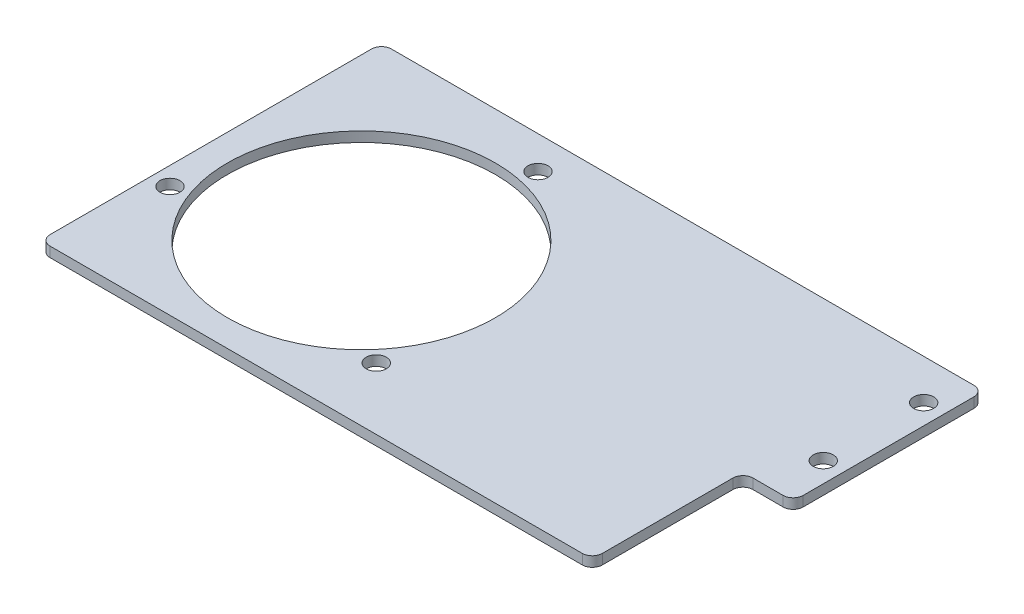
ISO-10303-21;
HEADER;
FILE_DESCRIPTION(('STEP AP214'),'2;1');
FILE_NAME('part.step','',(''),(''),'','','');
FILE_SCHEMA(('AUTOMOTIVE_DESIGN { 1 0 10303 214 1 1 1 1 }'));
ENDSEC;
DATA;
#1=APPLICATION_CONTEXT('core data for automotive mechanical design processes');
#2=APPLICATION_PROTOCOL_DEFINITION('international standard','automotive_design',2000,#1);
#3=PRODUCT_CONTEXT('',#1,'mechanical');
#4=PRODUCT('Part','Part','',(#3));
#5=PRODUCT_RELATED_PRODUCT_CATEGORY('part','',(#4));
#6=PRODUCT_DEFINITION_FORMATION('','',#4);
#7=PRODUCT_DEFINITION_CONTEXT('part definition',#1,'design');
#8=PRODUCT_DEFINITION('design','',#6,#7);
#9=PRODUCT_DEFINITION_SHAPE('','',#8);
#10=(LENGTH_UNIT() NAMED_UNIT(*) SI_UNIT(.MILLI.,.METRE.));
#11=(NAMED_UNIT(*) PLANE_ANGLE_UNIT() SI_UNIT($,.RADIAN.));
#12=(NAMED_UNIT(*) SI_UNIT($,.STERADIAN.) SOLID_ANGLE_UNIT());
#13=UNCERTAINTY_MEASURE_WITH_UNIT(LENGTH_MEASURE(1.E-05),#10,'distance_accuracy_value','');
#14=(GEOMETRIC_REPRESENTATION_CONTEXT(3) GLOBAL_UNCERTAINTY_ASSIGNED_CONTEXT((#13)) GLOBAL_UNIT_ASSIGNED_CONTEXT((#10,
#11,#12)) REPRESENTATION_CONTEXT('',''));
#15=CARTESIAN_POINT('',(0.,0.,0.));
#16=DIRECTION('',(0.,0.,1.));
#17=DIRECTION('',(1.,0.,0.));
#18=AXIS2_PLACEMENT_3D('',#15,#16,#17);
#19=CARTESIAN_POINT('',(254.,6.35,12.7));
#20=DIRECTION('',(0.,-1.,0.));
#21=DIRECTION('',(0.,0.,-1.));
#22=AXIS2_PLACEMENT_3D('',#19,#20,#21);
#23=PLANE('',#22);
#24=CARTESIAN_POINT('',(18.1745568096169,6.35,-93.4999892233898));
#25=DIRECTION('',(0.,1.,0.));
#26=DIRECTION('',(0.,0.,1.));
#27=AXIS2_PLACEMENT_3D('',#24,#25,#26);
#28=CIRCLE('',#27,6.34999999999998);
#29=CARTESIAN_POINT('',(18.1745568096169,6.35,-87.1499892233898));
#30=VERTEX_POINT('',#29);
#31=EDGE_CURVE('E299',#30,#30,#28,.T.);
#32=ORIENTED_EDGE('',*,*,#31,.F.);
#33=EDGE_LOOP('',(#32));
#34=FACE_BOUND('',#33,.T.);
#35=CARTESIAN_POINT('',(266.7,6.35,-88.9000000000001));
#36=DIRECTION('',(0.,1.,0.));
#37=DIRECTION('',(0.,0.,1.));
#38=AXIS2_PLACEMENT_3D('',#35,#36,#37);
#39=CIRCLE('',#38,6.35);
#40=CARTESIAN_POINT('',(266.7,6.35,-82.5500000000001));
#41=VERTEX_POINT('',#40);
#42=EDGE_CURVE('E311',#41,#41,#39,.T.);
#43=ORIENTED_EDGE('',*,*,#42,.F.);
#44=EDGE_LOOP('',(#43));
#45=FACE_BOUND('',#44,.T.);
#46=CARTESIAN_POINT('',(0.,6.35,0.));
#47=DIRECTION('',(0.,1.,0.));
#48=DIRECTION('',(0.,0.,1.));
#49=AXIS2_PLACEMENT_3D('',#46,#47,#48);
#50=CIRCLE('',#49,84.7725);
#51=CARTESIAN_POINT('',(0.,6.35,84.7725));
#52=VERTEX_POINT('',#51);
#53=EDGE_CURVE('E157',#52,#52,#50,.T.);
#54=ORIENTED_EDGE('',*,*,#53,.F.);
#55=EDGE_LOOP('',(#54));
#56=FACE_BOUND('',#55,.T.);
#57=CARTESIAN_POINT('',(254.,6.35,12.7));
#58=DIRECTION('',(0.,-1.,0.));
#59=DIRECTION('',(0.,0.,-1.));
#60=AXIS2_PLACEMENT_3D('',#57,#58,#59);
#61=CIRCLE('',#60,6.35);
#62=CARTESIAN_POINT('',(247.65,6.35,12.7));
#63=VERTEX_POINT('',#62);
#64=CARTESIAN_POINT('',(254.,6.35,6.34999999999998));
#65=VERTEX_POINT('',#64);
#66=EDGE_CURVE('E176',#63,#65,#61,.T.);
#67=ORIENTED_EDGE('',*,*,#66,.T.);
#68=DIRECTION('',(1.,0.,0.));
#69=VECTOR('',#68,1.);
#70=CARTESIAN_POINT('',(254.,6.35,6.34999999999998));
#71=LINE('',#70,#69);
#72=CARTESIAN_POINT('',(273.05,6.35,6.34999999999999));
#73=VERTEX_POINT('',#72);
#74=EDGE_CURVE('E104',#65,#73,#71,.T.);
#75=ORIENTED_EDGE('',*,*,#74,.T.);
#76=CARTESIAN_POINT('',(273.05,6.35,0.));
#77=DIRECTION('',(0.,1.,0.));
#78=DIRECTION('',(0.,0.,1.));
#79=AXIS2_PLACEMENT_3D('',#76,#77,#78);
#80=CIRCLE('',#79,6.35000000000001);
#81=CARTESIAN_POINT('',(279.4,6.35,0.));
#82=VERTEX_POINT('',#81);
#83=EDGE_CURVE('E203',#73,#82,#80,.T.);
#84=ORIENTED_EDGE('',*,*,#83,.T.);
#85=DIRECTION('',(0.,0.,-1.));
#86=VECTOR('',#85,1.);
#87=CARTESIAN_POINT('',(279.4,6.35,-107.95));
#88=LINE('',#87,#86);
#89=CARTESIAN_POINT('',(279.4,6.35,-107.95));
#90=VERTEX_POINT('',#89);
#91=EDGE_CURVE('E222',#82,#90,#88,.T.);
#92=ORIENTED_EDGE('',*,*,#91,.T.);
#93=CARTESIAN_POINT('',(273.05,6.35,-107.95));
#94=DIRECTION('',(0.,1.,0.));
#95=DIRECTION('',(0.,0.,-1.));
#96=AXIS2_PLACEMENT_3D('',#93,#94,#95);
#97=CIRCLE('',#96,6.35000000000002);
#98=CARTESIAN_POINT('',(273.05,6.35,-114.3));
#99=VERTEX_POINT('',#98);
#100=EDGE_CURVE('E219',#90,#99,#97,.T.);
#101=ORIENTED_EDGE('',*,*,#100,.T.);
#102=DIRECTION('',(-1.,0.,0.));
#103=VECTOR('',#102,1.);
#104=CARTESIAN_POINT('',(273.05,6.35,-114.3));
#105=LINE('',#104,#103);
#106=CARTESIAN_POINT('',(-95.25,6.35,-114.3));
#107=VERTEX_POINT('',#106);
#108=EDGE_CURVE('E221',#99,#107,#105,.T.);
#109=ORIENTED_EDGE('',*,*,#108,.T.);
#110=CARTESIAN_POINT('',(-95.25,6.35,-107.95));
#111=DIRECTION('',(0.,1.,0.));
#112=DIRECTION('',(0.,0.,1.));
#113=AXIS2_PLACEMENT_3D('',#110,#111,#112);
#114=CIRCLE('',#113,6.35);
#115=CARTESIAN_POINT('',(-101.6,6.35,-107.95));
#116=VERTEX_POINT('',#115);
#117=EDGE_CURVE('E224',#107,#116,#114,.T.);
#118=ORIENTED_EDGE('',*,*,#117,.T.);
#119=DIRECTION('',(0.,0.,1.));
#120=VECTOR('',#119,1.);
#121=CARTESIAN_POINT('',(-101.6,6.35,-107.95));
#122=LINE('',#121,#120);
#123=CARTESIAN_POINT('',(-101.6,6.35,95.25));
#124=VERTEX_POINT('',#123);
#125=EDGE_CURVE('E230',#116,#124,#122,.T.);
#126=ORIENTED_EDGE('',*,*,#125,.T.);
#127=CARTESIAN_POINT('',(-95.2499999999999,6.35,95.2500000000001));
#128=DIRECTION('',(0.,1.,0.));
#129=DIRECTION('',(0.,0.,-1.));
#130=AXIS2_PLACEMENT_3D('',#127,#128,#129);
#131=CIRCLE('',#130,6.34999999999999);
#132=CARTESIAN_POINT('',(-95.2499999999999,6.35,101.6));
#133=VERTEX_POINT('',#132);
#134=EDGE_CURVE('E135',#124,#133,#131,.T.);
#135=ORIENTED_EDGE('',*,*,#134,.T.);
#136=DIRECTION('',(1.,0.,0.));
#137=VECTOR('',#136,1.);
#138=CARTESIAN_POINT('',(241.3,6.35,101.6));
#139=LINE('',#138,#137);
#140=CARTESIAN_POINT('',(241.3,6.35,101.6));
#141=VERTEX_POINT('',#140);
#142=EDGE_CURVE('E129',#133,#141,#139,.T.);
#143=ORIENTED_EDGE('',*,*,#142,.T.);
#144=CARTESIAN_POINT('',(241.3,6.35,95.25));
#145=DIRECTION('',(0.,1.,0.));
#146=DIRECTION('',(0.,0.,1.));
#147=AXIS2_PLACEMENT_3D('',#144,#145,#146);
#148=CIRCLE('',#147,6.34999999999999);
#149=CARTESIAN_POINT('',(247.65,6.35,95.25));
#150=VERTEX_POINT('',#149);
#151=EDGE_CURVE('E133',#141,#150,#148,.T.);
#152=ORIENTED_EDGE('',*,*,#151,.T.);
#153=DIRECTION('',(0.,0.,-1.));
#154=VECTOR('',#153,1.);
#155=CARTESIAN_POINT('',(247.65,6.35,95.25));
#156=LINE('',#155,#154);
#157=EDGE_CURVE('E49',#150,#63,#156,.T.);
#158=ORIENTED_EDGE('',*,*,#157,.T.);
#159=EDGE_LOOP('',(#67,#75,#84,#92,#101,#109,#118,#126,#135,#143,#152,#158));
#160=FACE_BOUND('',#159,.T.);
#161=CARTESIAN_POINT('',(-90.0606443258351,6.35,31.0103667120436));
#162=DIRECTION('',(0.,1.,0.));
#163=DIRECTION('',(0.,0.,1.));
#164=AXIS2_PLACEMENT_3D('',#161,#162,#163);
#165=CIRCLE('',#164,6.35);
#166=CARTESIAN_POINT('',(-90.0606443258351,6.35,37.3603667120436));
#167=VERTEX_POINT('',#166);
#168=EDGE_CURVE('E317',#167,#167,#165,.T.);
#169=ORIENTED_EDGE('',*,*,#168,.F.);
#170=EDGE_LOOP('',(#169));
#171=FACE_BOUND('',#170,.T.);
#172=CARTESIAN_POINT('',(266.7,6.35,-25.4000000000001));
#173=DIRECTION('',(0.,1.,0.));
#174=DIRECTION('',(0.,0.,1.));
#175=AXIS2_PLACEMENT_3D('',#172,#173,#174);
#176=CIRCLE('',#175,6.35);
#177=CARTESIAN_POINT('',(266.7,6.35,-19.0500000000001));
#178=VERTEX_POINT('',#177);
#179=EDGE_CURVE('E305',#178,#178,#176,.T.);
#180=ORIENTED_EDGE('',*,*,#179,.F.);
#181=EDGE_LOOP('',(#180));
#182=FACE_BOUND('',#181,.T.);
#183=CARTESIAN_POINT('',(71.8860875162181,6.35,62.4896225113469));
#184=DIRECTION('',(0.,1.,0.));
#185=DIRECTION('',(0.,0.,1.));
#186=AXIS2_PLACEMENT_3D('',#183,#184,#185);
#187=CIRCLE('',#186,6.35);
#188=CARTESIAN_POINT('',(71.8860875162181,6.35,68.8396225113469));
#189=VERTEX_POINT('',#188);
#190=EDGE_CURVE('E290',#189,#189,#187,.T.);
#191=ORIENTED_EDGE('',*,*,#190,.F.);
#192=EDGE_LOOP('',(#191));
#193=FACE_BOUND('',#192,.T.);
#194=ADVANCED_FACE('F32',(#34,#45,#56,#160,#171,#182,#193),#23,.F.);
#195=CARTESIAN_POINT('',(254.,0.,12.7));
#196=DIRECTION('',(0.,-1.,0.));
#197=DIRECTION('',(0.,0.,-1.));
#198=AXIS2_PLACEMENT_3D('',#195,#196,#197);
#199=PLANE('',#198);
#200=CARTESIAN_POINT('',(18.1745568096169,0.,-93.4999892233898));
#201=DIRECTION('',(0.,1.,0.));
#202=DIRECTION('',(0.,0.,1.));
#203=AXIS2_PLACEMENT_3D('',#200,#201,#202);
#204=CIRCLE('',#203,6.34999999999998);
#205=CARTESIAN_POINT('',(18.1745568096169,0.,-87.1499892233898));
#206=VERTEX_POINT('',#205);
#207=EDGE_CURVE('E296',#206,#206,#204,.T.);
#208=ORIENTED_EDGE('',*,*,#207,.T.);
#209=EDGE_LOOP('',(#208));
#210=FACE_BOUND('',#209,.T.);
#211=CARTESIAN_POINT('',(266.7,0.,-88.9000000000001));
#212=DIRECTION('',(0.,1.,0.));
#213=DIRECTION('',(0.,0.,1.));
#214=AXIS2_PLACEMENT_3D('',#211,#212,#213);
#215=CIRCLE('',#214,6.35);
#216=CARTESIAN_POINT('',(266.7,0.,-82.5500000000001));
#217=VERTEX_POINT('',#216);
#218=EDGE_CURVE('E308',#217,#217,#215,.T.);
#219=ORIENTED_EDGE('',*,*,#218,.T.);
#220=EDGE_LOOP('',(#219));
#221=FACE_BOUND('',#220,.T.);
#222=CARTESIAN_POINT('',(0.,0.,0.));
#223=DIRECTION('',(0.,1.,0.));
#224=DIRECTION('',(0.,0.,1.));
#225=AXIS2_PLACEMENT_3D('',#222,#223,#224);
#226=CIRCLE('',#225,84.7725);
#227=CARTESIAN_POINT('',(0.,0.,84.7725));
#228=VERTEX_POINT('',#227);
#229=EDGE_CURVE('E320',#228,#228,#226,.T.);
#230=ORIENTED_EDGE('',*,*,#229,.T.);
#231=EDGE_LOOP('',(#230));
#232=FACE_BOUND('',#231,.T.);
#233=CARTESIAN_POINT('',(254.,0.,12.7));
#234=DIRECTION('',(0.,-1.,0.));
#235=DIRECTION('',(0.,0.,-1.));
#236=AXIS2_PLACEMENT_3D('',#233,#234,#235);
#237=CIRCLE('',#236,6.35);
#238=CARTESIAN_POINT('',(247.65,0.,12.7));
#239=VERTEX_POINT('',#238);
#240=CARTESIAN_POINT('',(254.,0.,6.34999999999998));
#241=VERTEX_POINT('',#240);
#242=EDGE_CURVE('E153',#239,#241,#237,.T.);
#243=ORIENTED_EDGE('',*,*,#242,.F.);
#244=DIRECTION('',(0.,0.,-1.));
#245=VECTOR('',#244,1.);
#246=CARTESIAN_POINT('',(247.65,0.,95.25));
#247=LINE('',#246,#245);
#248=CARTESIAN_POINT('',(247.65,0.,95.25));
#249=VERTEX_POINT('',#248);
#250=EDGE_CURVE('E96',#249,#239,#247,.T.);
#251=ORIENTED_EDGE('',*,*,#250,.F.);
#252=CARTESIAN_POINT('',(241.3,0.,95.25));
#253=DIRECTION('',(0.,1.,0.));
#254=DIRECTION('',(0.,0.,1.));
#255=AXIS2_PLACEMENT_3D('',#252,#253,#254);
#256=CIRCLE('',#255,6.34999999999999);
#257=CARTESIAN_POINT('',(241.3,0.,101.6));
#258=VERTEX_POINT('',#257);
#259=EDGE_CURVE('E90',#258,#249,#256,.T.);
#260=ORIENTED_EDGE('',*,*,#259,.F.);
#261=DIRECTION('',(1.,0.,0.));
#262=VECTOR('',#261,1.);
#263=CARTESIAN_POINT('',(241.3,0.,101.6));
#264=LINE('',#263,#262);
#265=CARTESIAN_POINT('',(-95.2499999999999,0.,101.6));
#266=VERTEX_POINT('',#265);
#267=EDGE_CURVE('E143',#266,#258,#264,.T.);
#268=ORIENTED_EDGE('',*,*,#267,.F.);
#269=CARTESIAN_POINT('',(-95.2499999999999,0.,95.2500000000001));
#270=DIRECTION('',(0.,1.,0.));
#271=DIRECTION('',(0.,0.,-1.));
#272=AXIS2_PLACEMENT_3D('',#269,#270,#271);
#273=CIRCLE('',#272,6.34999999999999);
#274=CARTESIAN_POINT('',(-101.6,0.,95.25));
#275=VERTEX_POINT('',#274);
#276=EDGE_CURVE('E171',#275,#266,#273,.T.);
#277=ORIENTED_EDGE('',*,*,#276,.F.);
#278=DIRECTION('',(0.,0.,1.));
#279=VECTOR('',#278,1.);
#280=CARTESIAN_POINT('',(-101.6,0.,-107.95));
#281=LINE('',#280,#279);
#282=CARTESIAN_POINT('',(-101.6,0.,-107.95));
#283=VERTEX_POINT('',#282);
#284=EDGE_CURVE('E169',#283,#275,#281,.T.);
#285=ORIENTED_EDGE('',*,*,#284,.F.);
#286=CARTESIAN_POINT('',(-95.25,0.,-107.95));
#287=DIRECTION('',(0.,1.,0.));
#288=DIRECTION('',(0.,0.,1.));
#289=AXIS2_PLACEMENT_3D('',#286,#287,#288);
#290=CIRCLE('',#289,6.35);
#291=CARTESIAN_POINT('',(-95.25,0.,-114.3));
#292=VERTEX_POINT('',#291);
#293=EDGE_CURVE('E167',#292,#283,#290,.T.);
#294=ORIENTED_EDGE('',*,*,#293,.F.);
#295=DIRECTION('',(-1.,0.,0.));
#296=VECTOR('',#295,1.);
#297=CARTESIAN_POINT('',(273.05,0.,-114.3));
#298=LINE('',#297,#296);
#299=CARTESIAN_POINT('',(273.05,0.,-114.3));
#300=VERTEX_POINT('',#299);
#301=EDGE_CURVE('E165',#300,#292,#298,.T.);
#302=ORIENTED_EDGE('',*,*,#301,.F.);
#303=CARTESIAN_POINT('',(273.05,0.,-107.95));
#304=DIRECTION('',(0.,1.,0.));
#305=DIRECTION('',(0.,0.,-1.));
#306=AXIS2_PLACEMENT_3D('',#303,#304,#305);
#307=CIRCLE('',#306,6.35000000000002);
#308=CARTESIAN_POINT('',(279.4,0.,-107.95));
#309=VERTEX_POINT('',#308);
#310=EDGE_CURVE('E163',#309,#300,#307,.T.);
#311=ORIENTED_EDGE('',*,*,#310,.F.);
#312=DIRECTION('',(0.,0.,-1.));
#313=VECTOR('',#312,1.);
#314=CARTESIAN_POINT('',(279.4,0.,-107.95));
#315=LINE('',#314,#313);
#316=CARTESIAN_POINT('',(279.4,0.,0.));
#317=VERTEX_POINT('',#316);
#318=EDGE_CURVE('E161',#317,#309,#315,.T.);
#319=ORIENTED_EDGE('',*,*,#318,.F.);
#320=CARTESIAN_POINT('',(273.05,0.,0.));
#321=DIRECTION('',(0.,1.,0.));
#322=DIRECTION('',(0.,0.,1.));
#323=AXIS2_PLACEMENT_3D('',#320,#321,#322);
#324=CIRCLE('',#323,6.35000000000001);
#325=CARTESIAN_POINT('',(273.05,0.,6.34999999999999));
#326=VERTEX_POINT('',#325);
#327=EDGE_CURVE('E159',#326,#317,#324,.T.);
#328=ORIENTED_EDGE('',*,*,#327,.F.);
#329=DIRECTION('',(1.,0.,0.));
#330=VECTOR('',#329,1.);
#331=CARTESIAN_POINT('',(254.,0.,6.34999999999998));
#332=LINE('',#331,#330);
#333=EDGE_CURVE('E156',#241,#326,#332,.T.);
#334=ORIENTED_EDGE('',*,*,#333,.F.);
#335=EDGE_LOOP('',(#243,#251,#260,#268,#277,#285,#294,#302,#311,#319,#328,#334));
#336=FACE_BOUND('',#335,.T.);
#337=CARTESIAN_POINT('',(-90.0606443258351,0.,31.0103667120436));
#338=DIRECTION('',(0.,1.,0.));
#339=DIRECTION('',(0.,0.,1.));
#340=AXIS2_PLACEMENT_3D('',#337,#338,#339);
#341=CIRCLE('',#340,6.35);
#342=CARTESIAN_POINT('',(-90.0606443258351,0.,37.3603667120436));
#343=VERTEX_POINT('',#342);
#344=EDGE_CURVE('E314',#343,#343,#341,.T.);
#345=ORIENTED_EDGE('',*,*,#344,.T.);
#346=EDGE_LOOP('',(#345));
#347=FACE_BOUND('',#346,.T.);
#348=CARTESIAN_POINT('',(266.7,0.,-25.4000000000001));
#349=DIRECTION('',(0.,1.,0.));
#350=DIRECTION('',(0.,0.,1.));
#351=AXIS2_PLACEMENT_3D('',#348,#349,#350);
#352=CIRCLE('',#351,6.35);
#353=CARTESIAN_POINT('',(266.7,0.,-19.0500000000001));
#354=VERTEX_POINT('',#353);
#355=EDGE_CURVE('E302',#354,#354,#352,.T.);
#356=ORIENTED_EDGE('',*,*,#355,.T.);
#357=EDGE_LOOP('',(#356));
#358=FACE_BOUND('',#357,.T.);
#359=CARTESIAN_POINT('',(71.8860875162181,0.,62.4896225113469));
#360=DIRECTION('',(0.,1.,0.));
#361=DIRECTION('',(0.,0.,1.));
#362=AXIS2_PLACEMENT_3D('',#359,#360,#361);
#363=CIRCLE('',#362,6.35);
#364=CARTESIAN_POINT('',(71.8860875162181,0.,68.8396225113469));
#365=VERTEX_POINT('',#364);
#366=EDGE_CURVE('E293',#365,#365,#363,.T.);
#367=ORIENTED_EDGE('',*,*,#366,.T.);
#368=EDGE_LOOP('',(#367));
#369=FACE_BOUND('',#368,.T.);
#370=ADVANCED_FACE('F207',(#210,#221,#232,#336,#347,#358,#369),#199,.T.);
#371=CARTESIAN_POINT('',(254.,6.35,12.7));
#372=DIRECTION('',(0.,-1.,0.));
#373=DIRECTION('',(0.,0.,-1.));
#374=AXIS2_PLACEMENT_3D('',#371,#372,#373);
#375=CYLINDRICAL_SURFACE('',#374,6.35);
#376=ORIENTED_EDGE('',*,*,#242,.T.);
#377=DIRECTION('',(0.,-1.,0.));
#378=VECTOR('',#377,1.);
#379=CARTESIAN_POINT('',(254.,6.35,6.34999999999998));
#380=LINE('',#379,#378);
#381=EDGE_CURVE('E11',#65,#241,#380,.T.);
#382=ORIENTED_EDGE('',*,*,#381,.F.);
#383=ORIENTED_EDGE('',*,*,#66,.F.);
#384=DIRECTION('',(0.,-1.,0.));
#385=VECTOR('',#384,1.);
#386=CARTESIAN_POINT('',(247.65,6.35,12.7));
#387=LINE('',#386,#385);
#388=EDGE_CURVE('E149',#63,#239,#387,.T.);
#389=ORIENTED_EDGE('',*,*,#388,.T.);
#390=EDGE_LOOP('',(#376,#382,#383,#389));
#391=FACE_BOUND('',#390,.T.);
#392=ADVANCED_FACE('F34',(#391),#375,.F.);
#393=CARTESIAN_POINT('',(254.,6.35,6.34999999999998));
#394=DIRECTION('',(0.,0.,-1.));
#395=DIRECTION('',(-1.,0.,0.));
#396=AXIS2_PLACEMENT_3D('',#393,#394,#395);
#397=PLANE('',#396);
#398=ORIENTED_EDGE('',*,*,#333,.T.);
#399=DIRECTION('',(0.,-1.,0.));
#400=VECTOR('',#399,1.);
#401=CARTESIAN_POINT('',(273.05,6.35,6.34999999999999));
#402=LINE('',#401,#400);
#403=EDGE_CURVE('E41',#73,#326,#402,.T.);
#404=ORIENTED_EDGE('',*,*,#403,.F.);
#405=ORIENTED_EDGE('',*,*,#74,.F.);
#406=ORIENTED_EDGE('',*,*,#381,.T.);
#407=EDGE_LOOP('',(#398,#404,#405,#406));
#408=FACE_BOUND('',#407,.T.);
#409=ADVANCED_FACE('F447',(#408),#397,.F.);
#410=CARTESIAN_POINT('',(273.05,6.35,0.));
#411=DIRECTION('',(0.,-1.,0.));
#412=DIRECTION('',(0.,0.,-1.));
#413=AXIS2_PLACEMENT_3D('',#410,#411,#412);
#414=CYLINDRICAL_SURFACE('',#413,6.35000000000001);
#415=ORIENTED_EDGE('',*,*,#327,.T.);
#416=DIRECTION('',(0.,-1.,0.));
#417=VECTOR('',#416,1.);
#418=CARTESIAN_POINT('',(279.4,6.35,0.));
#419=LINE('',#418,#417);
#420=EDGE_CURVE('E195',#82,#317,#419,.T.);
#421=ORIENTED_EDGE('',*,*,#420,.F.);
#422=ORIENTED_EDGE('',*,*,#83,.F.);
#423=ORIENTED_EDGE('',*,*,#403,.T.);
#424=EDGE_LOOP('',(#415,#421,#422,#423));
#425=FACE_BOUND('',#424,.T.);
#426=ADVANCED_FACE('F201',(#425),#414,.T.);
#427=CARTESIAN_POINT('',(279.4,6.35,-107.95));
#428=DIRECTION('',(-1.,0.,0.));
#429=DIRECTION('',(0.,0.,1.));
#430=AXIS2_PLACEMENT_3D('',#427,#428,#429);
#431=PLANE('',#430);
#432=ORIENTED_EDGE('',*,*,#318,.T.);
#433=DIRECTION('',(0.,-1.,0.));
#434=VECTOR('',#433,1.);
#435=CARTESIAN_POINT('',(279.4,6.35,-107.95));
#436=LINE('',#435,#434);
#437=EDGE_CURVE('E192',#90,#309,#436,.T.);
#438=ORIENTED_EDGE('',*,*,#437,.F.);
#439=ORIENTED_EDGE('',*,*,#91,.F.);
#440=ORIENTED_EDGE('',*,*,#420,.T.);
#441=EDGE_LOOP('',(#432,#438,#439,#440));
#442=FACE_BOUND('',#441,.T.);
#443=ADVANCED_FACE('F213',(#442),#431,.F.);
#444=CARTESIAN_POINT('',(273.05,6.35,-107.95));
#445=DIRECTION('',(0.,-1.,0.));
#446=DIRECTION('',(0.,0.,-1.));
#447=AXIS2_PLACEMENT_3D('',#444,#445,#446);
#448=CYLINDRICAL_SURFACE('',#447,6.35000000000002);
#449=ORIENTED_EDGE('',*,*,#310,.T.);
#450=DIRECTION('',(0.,-1.,0.));
#451=VECTOR('',#450,1.);
#452=CARTESIAN_POINT('',(273.05,6.35,-114.3));
#453=LINE('',#452,#451);
#454=EDGE_CURVE('E189',#99,#300,#453,.T.);
#455=ORIENTED_EDGE('',*,*,#454,.F.);
#456=ORIENTED_EDGE('',*,*,#100,.F.);
#457=ORIENTED_EDGE('',*,*,#437,.T.);
#458=EDGE_LOOP('',(#449,#455,#456,#457));
#459=FACE_BOUND('',#458,.T.);
#460=ADVANCED_FACE('F217',(#459),#448,.T.);
#461=CARTESIAN_POINT('',(273.05,6.35,-114.3));
#462=DIRECTION('',(0.,0.,1.));
#463=DIRECTION('',(1.,0.,0.));
#464=AXIS2_PLACEMENT_3D('',#461,#462,#463);
#465=PLANE('',#464);
#466=ORIENTED_EDGE('',*,*,#301,.T.);
#467=DIRECTION('',(0.,-1.,0.));
#468=VECTOR('',#467,1.);
#469=CARTESIAN_POINT('',(-95.25,6.35,-114.3));
#470=LINE('',#469,#468);
#471=EDGE_CURVE('E186',#107,#292,#470,.T.);
#472=ORIENTED_EDGE('',*,*,#471,.F.);
#473=ORIENTED_EDGE('',*,*,#108,.F.);
#474=ORIENTED_EDGE('',*,*,#454,.T.);
#475=EDGE_LOOP('',(#466,#472,#473,#474));
#476=FACE_BOUND('',#475,.T.);
#477=ADVANCED_FACE('F412',(#476),#465,.F.);
#478=CARTESIAN_POINT('',(-95.25,6.35,-107.95));
#479=DIRECTION('',(0.,-1.,0.));
#480=DIRECTION('',(0.,0.,-1.));
#481=AXIS2_PLACEMENT_3D('',#478,#479,#480);
#482=CYLINDRICAL_SURFACE('',#481,6.35);
#483=ORIENTED_EDGE('',*,*,#293,.T.);
#484=DIRECTION('',(0.,-1.,0.));
#485=VECTOR('',#484,1.);
#486=CARTESIAN_POINT('',(-101.6,6.35,-107.95));
#487=LINE('',#486,#485);
#488=EDGE_CURVE('E183',#116,#283,#487,.T.);
#489=ORIENTED_EDGE('',*,*,#488,.F.);
#490=ORIENTED_EDGE('',*,*,#117,.F.);
#491=ORIENTED_EDGE('',*,*,#471,.T.);
#492=EDGE_LOOP('',(#483,#489,#490,#491));
#493=FACE_BOUND('',#492,.T.);
#494=ADVANCED_FACE('F403',(#493),#482,.T.);
#495=CARTESIAN_POINT('',(-101.6,6.35,-107.95));
#496=DIRECTION('',(1.,0.,0.));
#497=DIRECTION('',(0.,0.,-1.));
#498=AXIS2_PLACEMENT_3D('',#495,#496,#497);
#499=PLANE('',#498);
#500=ORIENTED_EDGE('',*,*,#284,.T.);
#501=DIRECTION('',(0.,-1.,0.));
#502=VECTOR('',#501,1.);
#503=CARTESIAN_POINT('',(-101.6,6.35,95.25));
#504=LINE('',#503,#502);
#505=EDGE_CURVE('E180',#124,#275,#504,.T.);
#506=ORIENTED_EDGE('',*,*,#505,.F.);
#507=ORIENTED_EDGE('',*,*,#125,.F.);
#508=ORIENTED_EDGE('',*,*,#488,.T.);
#509=EDGE_LOOP('',(#500,#506,#507,#508));
#510=FACE_BOUND('',#509,.T.);
#511=ADVANCED_FACE('F236',(#510),#499,.F.);
#512=CARTESIAN_POINT('',(-95.2499999999999,6.35,95.2500000000001));
#513=DIRECTION('',(0.,-1.,0.));
#514=DIRECTION('',(0.,0.,-1.));
#515=AXIS2_PLACEMENT_3D('',#512,#513,#514);
#516=CYLINDRICAL_SURFACE('',#515,6.34999999999999);
#517=ORIENTED_EDGE('',*,*,#276,.T.);
#518=DIRECTION('',(0.,-1.,0.));
#519=VECTOR('',#518,1.);
#520=CARTESIAN_POINT('',(-95.2499999999999,6.35,101.6));
#521=LINE('',#520,#519);
#522=EDGE_CURVE('E144',#133,#266,#521,.T.);
#523=ORIENTED_EDGE('',*,*,#522,.F.);
#524=ORIENTED_EDGE('',*,*,#134,.F.);
#525=ORIENTED_EDGE('',*,*,#505,.T.);
#526=EDGE_LOOP('',(#517,#523,#524,#525));
#527=FACE_BOUND('',#526,.T.);
#528=ADVANCED_FACE('F240',(#527),#516,.T.);
#529=CARTESIAN_POINT('',(241.3,6.35,101.6));
#530=DIRECTION('',(0.,0.,-1.));
#531=DIRECTION('',(-1.,0.,0.));
#532=AXIS2_PLACEMENT_3D('',#529,#530,#531);
#533=PLANE('',#532);
#534=ORIENTED_EDGE('',*,*,#267,.T.);
#535=DIRECTION('',(0.,-1.,0.));
#536=VECTOR('',#535,1.);
#537=CARTESIAN_POINT('',(241.3,6.35,101.6));
#538=LINE('',#537,#536);
#539=EDGE_CURVE('E140',#141,#258,#538,.T.);
#540=ORIENTED_EDGE('',*,*,#539,.F.);
#541=ORIENTED_EDGE('',*,*,#142,.F.);
#542=ORIENTED_EDGE('',*,*,#522,.T.);
#543=EDGE_LOOP('',(#534,#540,#541,#542));
#544=FACE_BOUND('',#543,.T.);
#545=ADVANCED_FACE('F141',(#544),#533,.F.);
#546=CARTESIAN_POINT('',(241.3,6.35,95.25));
#547=DIRECTION('',(0.,-1.,0.));
#548=DIRECTION('',(0.,0.,-1.));
#549=AXIS2_PLACEMENT_3D('',#546,#547,#548);
#550=CYLINDRICAL_SURFACE('',#549,6.34999999999999);
#551=ORIENTED_EDGE('',*,*,#259,.T.);
#552=DIRECTION('',(0.,-1.,0.));
#553=VECTOR('',#552,1.);
#554=CARTESIAN_POINT('',(247.65,6.35,95.25));
#555=LINE('',#554,#553);
#556=EDGE_CURVE('E145',#150,#249,#555,.T.);
#557=ORIENTED_EDGE('',*,*,#556,.F.);
#558=ORIENTED_EDGE('',*,*,#151,.F.);
#559=ORIENTED_EDGE('',*,*,#539,.T.);
#560=EDGE_LOOP('',(#551,#557,#558,#559));
#561=FACE_BOUND('',#560,.T.);
#562=ADVANCED_FACE('F147',(#561),#550,.T.);
#563=CARTESIAN_POINT('',(247.65,6.35,95.25));
#564=DIRECTION('',(-1.,0.,0.));
#565=DIRECTION('',(0.,0.,1.));
#566=AXIS2_PLACEMENT_3D('',#563,#564,#565);
#567=PLANE('',#566);
#568=ORIENTED_EDGE('',*,*,#250,.T.);
#569=ORIENTED_EDGE('',*,*,#388,.F.);
#570=ORIENTED_EDGE('',*,*,#157,.F.);
#571=ORIENTED_EDGE('',*,*,#556,.T.);
#572=EDGE_LOOP('',(#568,#569,#570,#571));
#573=FACE_BOUND('',#572,.T.);
#574=ADVANCED_FACE('F244',(#573),#567,.F.);
#575=CARTESIAN_POINT('',(0.,6.35,0.));
#576=DIRECTION('',(0.,-1.,0.));
#577=DIRECTION('',(0.,0.,-1.));
#578=AXIS2_PLACEMENT_3D('',#575,#576,#577);
#579=CYLINDRICAL_SURFACE('',#578,84.7725);
#580=ORIENTED_EDGE('',*,*,#53,.T.);
#581=EDGE_LOOP('',(#580));
#582=FACE_BOUND('',#581,.T.);
#583=ORIENTED_EDGE('',*,*,#229,.F.);
#584=EDGE_LOOP('',(#583));
#585=FACE_BOUND('',#584,.T.);
#586=ADVANCED_FACE('F246',(#582,#585),#579,.F.);
#587=CARTESIAN_POINT('',(-90.0606443258351,6.35,31.0103667120436));
#588=DIRECTION('',(0.,-1.,0.));
#589=DIRECTION('',(0.,0.,-1.));
#590=AXIS2_PLACEMENT_3D('',#587,#588,#589);
#591=CYLINDRICAL_SURFACE('',#590,6.35);
#592=ORIENTED_EDGE('',*,*,#168,.T.);
#593=EDGE_LOOP('',(#592));
#594=FACE_BOUND('',#593,.T.);
#595=ORIENTED_EDGE('',*,*,#344,.F.);
#596=EDGE_LOOP('',(#595));
#597=FACE_BOUND('',#596,.T.);
#598=ADVANCED_FACE('F252',(#594,#597),#591,.F.);
#599=CARTESIAN_POINT('',(266.7,6.35,-88.9000000000001));
#600=DIRECTION('',(0.,-1.,0.));
#601=DIRECTION('',(0.,0.,-1.));
#602=AXIS2_PLACEMENT_3D('',#599,#600,#601);
#603=CYLINDRICAL_SURFACE('',#602,6.35);
#604=ORIENTED_EDGE('',*,*,#42,.T.);
#605=EDGE_LOOP('',(#604));
#606=FACE_BOUND('',#605,.T.);
#607=ORIENTED_EDGE('',*,*,#218,.F.);
#608=EDGE_LOOP('',(#607));
#609=FACE_BOUND('',#608,.T.);
#610=ADVANCED_FACE('F269',(#606,#609),#603,.F.);
#611=CARTESIAN_POINT('',(266.7,6.35,-25.4000000000001));
#612=DIRECTION('',(0.,-1.,0.));
#613=DIRECTION('',(0.,0.,-1.));
#614=AXIS2_PLACEMENT_3D('',#611,#612,#613);
#615=CYLINDRICAL_SURFACE('',#614,6.35);
#616=ORIENTED_EDGE('',*,*,#179,.T.);
#617=EDGE_LOOP('',(#616));
#618=FACE_BOUND('',#617,.T.);
#619=ORIENTED_EDGE('',*,*,#355,.F.);
#620=EDGE_LOOP('',(#619));
#621=FACE_BOUND('',#620,.T.);
#622=ADVANCED_FACE('F273',(#618,#621),#615,.F.);
#623=CARTESIAN_POINT('',(18.1745568096169,6.35,-93.4999892233898));
#624=DIRECTION('',(0.,-1.,0.));
#625=DIRECTION('',(0.,0.,-1.));
#626=AXIS2_PLACEMENT_3D('',#623,#624,#625);
#627=CYLINDRICAL_SURFACE('',#626,6.34999999999998);
#628=ORIENTED_EDGE('',*,*,#31,.T.);
#629=EDGE_LOOP('',(#628));
#630=FACE_BOUND('',#629,.T.);
#631=ORIENTED_EDGE('',*,*,#207,.F.);
#632=EDGE_LOOP('',(#631));
#633=FACE_BOUND('',#632,.T.);
#634=ADVANCED_FACE('F277',(#630,#633),#627,.F.);
#635=CARTESIAN_POINT('',(71.8860875162181,6.35,62.4896225113469));
#636=DIRECTION('',(0.,-1.,0.));
#637=DIRECTION('',(0.,0.,-1.));
#638=AXIS2_PLACEMENT_3D('',#635,#636,#637);
#639=CYLINDRICAL_SURFACE('',#638,6.35);
#640=ORIENTED_EDGE('',*,*,#190,.T.);
#641=EDGE_LOOP('',(#640));
#642=FACE_BOUND('',#641,.T.);
#643=ORIENTED_EDGE('',*,*,#366,.F.);
#644=EDGE_LOOP('',(#643));
#645=FACE_BOUND('',#644,.T.);
#646=ADVANCED_FACE('F281',(#642,#645),#639,.F.);
#647=CLOSED_SHELL('',(#194,#370,#392,#409,#426,#443,#460,#477,#494,#511,#528,#545,#562,#574,
#586,#598,#610,#622,#634,#646));
#648=MANIFOLD_SOLID_BREP('B2',#647);
#649=ADVANCED_BREP_SHAPE_REPRESENTATION('',(#18,#648),#14);
#650=SHAPE_DEFINITION_REPRESENTATION(#9,#649);
ENDSEC;
END-ISO-10303-21;
